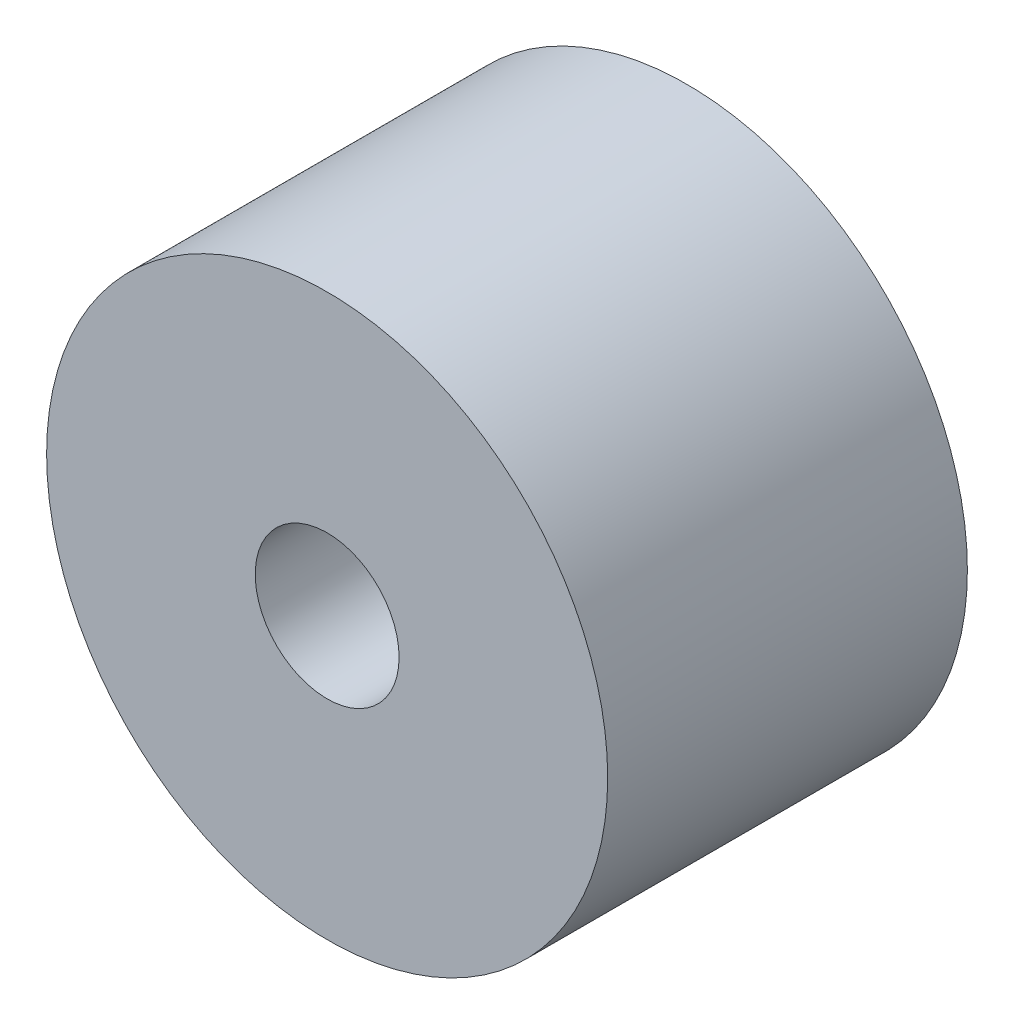
ISO-10303-21;
HEADER;
FILE_DESCRIPTION(('STEP AP214'),'2;1');
FILE_NAME('part.step','',(''),(''),'','','');
FILE_SCHEMA(('AUTOMOTIVE_DESIGN { 1 0 10303 214 1 1 1 1 }'));
ENDSEC;
DATA;
#1=APPLICATION_CONTEXT('core data for automotive mechanical design processes');
#2=APPLICATION_PROTOCOL_DEFINITION('international standard','automotive_design',2000,#1);
#3=PRODUCT_CONTEXT('',#1,'mechanical');
#4=PRODUCT('Part','Part','',(#3));
#5=PRODUCT_RELATED_PRODUCT_CATEGORY('part','',(#4));
#6=PRODUCT_DEFINITION_FORMATION('','',#4);
#7=PRODUCT_DEFINITION_CONTEXT('part definition',#1,'design');
#8=PRODUCT_DEFINITION('design','',#6,#7);
#9=PRODUCT_DEFINITION_SHAPE('','',#8);
#10=(LENGTH_UNIT() NAMED_UNIT(*) SI_UNIT(.MILLI.,.METRE.));
#11=(NAMED_UNIT(*) PLANE_ANGLE_UNIT() SI_UNIT($,.RADIAN.));
#12=(NAMED_UNIT(*) SI_UNIT($,.STERADIAN.) SOLID_ANGLE_UNIT());
#13=UNCERTAINTY_MEASURE_WITH_UNIT(LENGTH_MEASURE(1.E-05),#10,'distance_accuracy_value','');
#14=(GEOMETRIC_REPRESENTATION_CONTEXT(3) GLOBAL_UNCERTAINTY_ASSIGNED_CONTEXT((#13)) GLOBAL_UNIT_ASSIGNED_CONTEXT((#10,
#11,#12)) REPRESENTATION_CONTEXT('',''));
#15=CARTESIAN_POINT('',(0.,0.,0.));
#16=DIRECTION('',(0.,0.,1.));
#17=DIRECTION('',(1.,0.,0.));
#18=AXIS2_PLACEMENT_3D('',#15,#16,#17);
#19=CARTESIAN_POINT('',(0.,0.,12.5));
#20=DIRECTION('',(0.,0.,-1.));
#21=DIRECTION('',(-1.,0.,0.));
#22=AXIS2_PLACEMENT_3D('',#19,#20,#21);
#23=CYLINDRICAL_SURFACE('',#22,19.5);
#24=CARTESIAN_POINT('',(0.,0.,12.5));
#25=DIRECTION('',(0.,0.,1.));
#26=DIRECTION('',(1.,0.,0.));
#27=AXIS2_PLACEMENT_3D('',#24,#25,#26);
#28=CIRCLE('',#27,19.5);
#29=CARTESIAN_POINT('',(19.5,0.,12.5));
#30=VERTEX_POINT('',#29);
#31=EDGE_CURVE('E12',#30,#30,#28,.T.);
#32=ORIENTED_EDGE('',*,*,#31,.F.);
#33=EDGE_LOOP('',(#32));
#34=FACE_BOUND('',#33,.T.);
#35=CARTESIAN_POINT('',(0.,0.,-12.5));
#36=DIRECTION('',(0.,0.,1.));
#37=DIRECTION('',(1.,0.,0.));
#38=AXIS2_PLACEMENT_3D('',#35,#36,#37);
#39=CIRCLE('',#38,19.5);
#40=CARTESIAN_POINT('',(19.5,0.,-12.5));
#41=VERTEX_POINT('',#40);
#42=EDGE_CURVE('E49',#41,#41,#39,.T.);
#43=ORIENTED_EDGE('',*,*,#42,.T.);
#44=EDGE_LOOP('',(#43));
#45=FACE_BOUND('',#44,.T.);
#46=ADVANCED_FACE('F42',(#34,#45),#23,.T.);
#47=CARTESIAN_POINT('',(0.,0.,12.5));
#48=DIRECTION('',(0.,0.,1.));
#49=DIRECTION('',(1.,0.,0.));
#50=AXIS2_PLACEMENT_3D('',#47,#48,#49);
#51=PLANE('',#50);
#52=CARTESIAN_POINT('',(0.,0.,12.5));
#53=DIRECTION('',(0.,0.,1.));
#54=DIRECTION('',(1.,0.,0.));
#55=AXIS2_PLACEMENT_3D('',#52,#53,#54);
#56=CIRCLE('',#55,5.);
#57=CARTESIAN_POINT('',(5.,0.,12.5));
#58=VERTEX_POINT('',#57);
#59=EDGE_CURVE('E55',#58,#58,#56,.T.);
#60=ORIENTED_EDGE('',*,*,#59,.F.);
#61=EDGE_LOOP('',(#60));
#62=FACE_BOUND('',#61,.T.);
#63=ORIENTED_EDGE('',*,*,#31,.T.);
#64=EDGE_LOOP('',(#63));
#65=FACE_BOUND('',#64,.T.);
#66=ADVANCED_FACE('F71',(#62,#65),#51,.T.);
#67=CARTESIAN_POINT('',(0.,0.,-12.5));
#68=DIRECTION('',(0.,0.,1.));
#69=DIRECTION('',(1.,0.,0.));
#70=AXIS2_PLACEMENT_3D('',#67,#68,#69);
#71=PLANE('',#70);
#72=CARTESIAN_POINT('',(0.,0.,-12.5));
#73=DIRECTION('',(0.,0.,1.));
#74=DIRECTION('',(1.,0.,0.));
#75=AXIS2_PLACEMENT_3D('',#72,#73,#74);
#76=CIRCLE('',#75,5.);
#77=CARTESIAN_POINT('',(5.,0.,-12.5));
#78=VERTEX_POINT('',#77);
#79=EDGE_CURVE('E45',#78,#78,#76,.T.);
#80=ORIENTED_EDGE('',*,*,#79,.T.);
#81=EDGE_LOOP('',(#80));
#82=FACE_BOUND('',#81,.T.);
#83=ORIENTED_EDGE('',*,*,#42,.F.);
#84=EDGE_LOOP('',(#83));
#85=FACE_BOUND('',#84,.T.);
#86=ADVANCED_FACE('F62',(#82,#85),#71,.F.);
#87=CARTESIAN_POINT('',(0.,0.,-19.5));
#88=DIRECTION('',(0.,0.,1.));
#89=DIRECTION('',(1.,0.,0.));
#90=AXIS2_PLACEMENT_3D('',#87,#88,#89);
#91=CYLINDRICAL_SURFACE('',#90,5.);
#92=ORIENTED_EDGE('',*,*,#59,.T.);
#93=EDGE_LOOP('',(#92));
#94=FACE_BOUND('',#93,.T.);
#95=ORIENTED_EDGE('',*,*,#79,.F.);
#96=EDGE_LOOP('',(#95));
#97=FACE_BOUND('',#96,.T.);
#98=ADVANCED_FACE('F65',(#94,#97),#91,.F.);
#99=CLOSED_SHELL('',(#46,#66,#86,#98));
#100=MANIFOLD_SOLID_BREP('B2',#99);
#101=ADVANCED_BREP_SHAPE_REPRESENTATION('',(#18,#100),#14);
#102=SHAPE_DEFINITION_REPRESENTATION(#9,#101);
ENDSEC;
END-ISO-10303-21;
